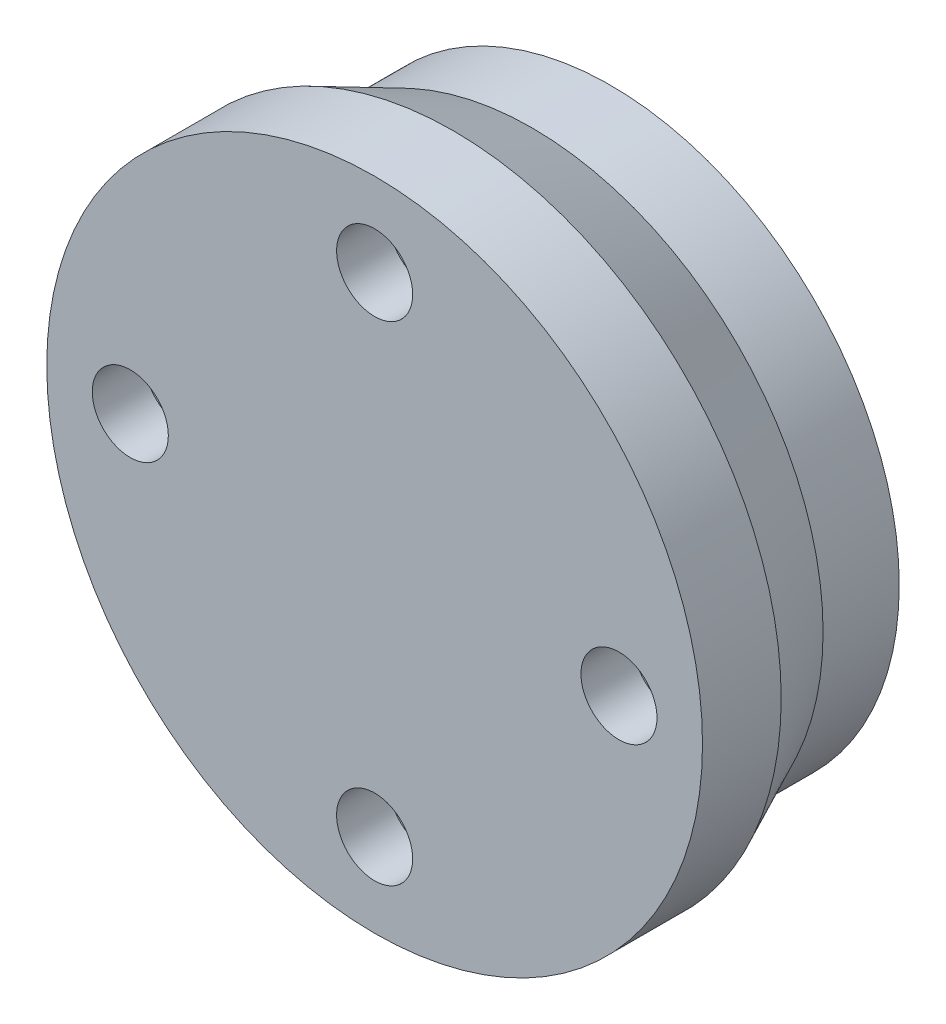
ISO-10303-21;
HEADER;
FILE_DESCRIPTION(('STEP AP214'),'2;1');
FILE_NAME('part.step','',(''),(''),'','','');
FILE_SCHEMA(('AUTOMOTIVE_DESIGN { 1 0 10303 214 1 1 1 1 }'));
ENDSEC;
DATA;
#1=APPLICATION_CONTEXT('core data for automotive mechanical design processes');
#2=APPLICATION_PROTOCOL_DEFINITION('international standard','automotive_design',2000,#1);
#3=PRODUCT_CONTEXT('',#1,'mechanical');
#4=PRODUCT('Part','Part','',(#3));
#5=PRODUCT_RELATED_PRODUCT_CATEGORY('part','',(#4));
#6=PRODUCT_DEFINITION_FORMATION('','',#4);
#7=PRODUCT_DEFINITION_CONTEXT('part definition',#1,'design');
#8=PRODUCT_DEFINITION('design','',#6,#7);
#9=PRODUCT_DEFINITION_SHAPE('','',#8);
#10=(LENGTH_UNIT() NAMED_UNIT(*) SI_UNIT(.MILLI.,.METRE.));
#11=(NAMED_UNIT(*) PLANE_ANGLE_UNIT() SI_UNIT($,.RADIAN.));
#12=(NAMED_UNIT(*) SI_UNIT($,.STERADIAN.) SOLID_ANGLE_UNIT());
#13=UNCERTAINTY_MEASURE_WITH_UNIT(LENGTH_MEASURE(1.E-05),#10,'distance_accuracy_value','');
#14=(GEOMETRIC_REPRESENTATION_CONTEXT(3) GLOBAL_UNCERTAINTY_ASSIGNED_CONTEXT((#13)) GLOBAL_UNIT_ASSIGNED_CONTEXT((#10,
#11,#12)) REPRESENTATION_CONTEXT('',''));
#15=CARTESIAN_POINT('',(0.,0.,0.));
#16=DIRECTION('',(0.,0.,1.));
#17=DIRECTION('',(1.,0.,0.));
#18=AXIS2_PLACEMENT_3D('',#15,#16,#17);
#19=CARTESIAN_POINT('',(0.,0.,1.5));
#20=DIRECTION('',(0.,0.,-1.));
#21=DIRECTION('',(-1.,0.,0.));
#22=AXIS2_PLACEMENT_3D('',#19,#20,#21);
#23=CYLINDRICAL_SURFACE('',#22,11.);
#24=CARTESIAN_POINT('',(0.,0.,1.5));
#25=DIRECTION('',(0.,0.,1.));
#26=DIRECTION('',(1.,0.,0.));
#27=AXIS2_PLACEMENT_3D('',#24,#25,#26);
#28=CIRCLE('',#27,11.);
#29=CARTESIAN_POINT('',(11.,0.,1.5));
#30=VERTEX_POINT('',#29);
#31=EDGE_CURVE('E10',#30,#30,#28,.T.);
#32=ORIENTED_EDGE('',*,*,#31,.F.);
#33=EDGE_LOOP('',(#32));
#34=FACE_BOUND('',#33,.T.);
#35=CARTESIAN_POINT('',(0.,0.,-1.5));
#36=DIRECTION('',(0.,0.,1.));
#37=DIRECTION('',(1.,0.,0.));
#38=AXIS2_PLACEMENT_3D('',#35,#36,#37);
#39=CIRCLE('',#38,11.);
#40=CARTESIAN_POINT('',(11.,0.,-1.5));
#41=VERTEX_POINT('',#40);
#42=EDGE_CURVE('E33',#41,#41,#39,.T.);
#43=ORIENTED_EDGE('',*,*,#42,.T.);
#44=EDGE_LOOP('',(#43));
#45=FACE_BOUND('',#44,.T.);
#46=ADVANCED_FACE('F30',(#34,#45),#23,.T.);
#47=CARTESIAN_POINT('',(0.,0.,-1.5));
#48=DIRECTION('',(0.,0.,1.));
#49=DIRECTION('',(1.,0.,0.));
#50=AXIS2_PLACEMENT_3D('',#47,#48,#49);
#51=PLANE('',#50);
#52=CARTESIAN_POINT('',(0.,7.5,-1.5));
#53=DIRECTION('',(0.,0.,-1.));
#54=DIRECTION('',(-1.,0.,0.));
#55=AXIS2_PLACEMENT_3D('',#52,#53,#54);
#56=CIRCLE('',#55,1.5);
#57=CARTESIAN_POINT('',(-1.50000000000005,7.5,-1.5));
#58=VERTEX_POINT('',#57);
#59=EDGE_CURVE('E93',#58,#58,#56,.T.);
#60=ORIENTED_EDGE('',*,*,#59,.F.);
#61=EDGE_LOOP('',(#60));
#62=FACE_BOUND('',#61,.T.);
#63=CARTESIAN_POINT('',(-7.5,0.,-1.5));
#64=DIRECTION('',(0.,0.,-1.));
#65=DIRECTION('',(-1.,0.,0.));
#66=AXIS2_PLACEMENT_3D('',#63,#64,#65);
#67=CIRCLE('',#66,1.50000000000027);
#68=CARTESIAN_POINT('',(-9.00000000000027,0.,-1.5));
#69=VERTEX_POINT('',#68);
#70=EDGE_CURVE('E87',#69,#69,#67,.T.);
#71=ORIENTED_EDGE('',*,*,#70,.F.);
#72=EDGE_LOOP('',(#71));
#73=FACE_BOUND('',#72,.T.);
#74=CARTESIAN_POINT('',(0.,-7.50000000000003,-1.5));
#75=DIRECTION('',(0.,0.,-1.));
#76=DIRECTION('',(-1.,0.,0.));
#77=AXIS2_PLACEMENT_3D('',#74,#75,#76);
#78=CIRCLE('',#77,1.50000000000043);
#79=CARTESIAN_POINT('',(-1.50000000000036,-7.50000000000003,-1.5));
#80=VERTEX_POINT('',#79);
#81=EDGE_CURVE('E81',#80,#80,#78,.T.);
#82=ORIENTED_EDGE('',*,*,#81,.F.);
#83=EDGE_LOOP('',(#82));
#84=FACE_BOUND('',#83,.T.);
#85=CARTESIAN_POINT('',(7.50000000000002,0.,-1.5));
#86=DIRECTION('',(0.,0.,-1.));
#87=DIRECTION('',(-1.,0.,0.));
#88=AXIS2_PLACEMENT_3D('',#85,#86,#87);
#89=CIRCLE('',#88,1.5000000000001);
#90=CARTESIAN_POINT('',(5.99999999999993,0.,-1.5));
#91=VERTEX_POINT('',#90);
#92=EDGE_CURVE('E75',#91,#91,#89,.T.);
#93=ORIENTED_EDGE('',*,*,#92,.F.);
#94=EDGE_LOOP('',(#93));
#95=FACE_BOUND('',#94,.T.);
#96=ORIENTED_EDGE('',*,*,#42,.F.);
#97=EDGE_LOOP('',(#96));
#98=FACE_BOUND('',#97,.T.);
#99=ADVANCED_FACE('F108',(#62,#73,#84,#95,#98),#51,.F.);
#100=CARTESIAN_POINT('',(0.,0.,1.5));
#101=DIRECTION('',(0.,0.,1.));
#102=DIRECTION('',(1.,0.,0.));
#103=AXIS2_PLACEMENT_3D('',#100,#101,#102);
#104=CONICAL_SURFACE('',#103,11.0964894023198,0.437587658819575);
#105=CARTESIAN_POINT('',(0.,0.,4.5));
#106=DIRECTION('',(0.,0.,1.));
#107=DIRECTION('',(1.,0.,0.));
#108=AXIS2_PLACEMENT_3D('',#105,#106,#107);
#109=CIRCLE('',#108,12.5);
#110=CARTESIAN_POINT('',(12.5,0.,4.5));
#111=VERTEX_POINT('',#110);
#112=EDGE_CURVE('E45',#111,#111,#109,.T.);
#113=ORIENTED_EDGE('',*,*,#112,.F.);
#114=EDGE_LOOP('',(#113));
#115=FACE_BOUND('',#114,.T.);
#116=CARTESIAN_POINT('',(0.,0.,1.5));
#117=DIRECTION('',(0.,0.,-1.));
#118=DIRECTION('',(-1.,0.,0.));
#119=AXIS2_PLACEMENT_3D('',#116,#117,#118);
#120=CIRCLE('',#119,11.0964894023198);
#121=CARTESIAN_POINT('',(-11.0964894023198,0.,1.5));
#122=VERTEX_POINT('',#121);
#123=EDGE_CURVE('E40',#122,#122,#120,.T.);
#124=ORIENTED_EDGE('',*,*,#123,.F.);
#125=EDGE_LOOP('',(#124));
#126=FACE_BOUND('',#125,.T.);
#127=ADVANCED_FACE('F111',(#115,#126),#104,.T.);
#128=CARTESIAN_POINT('',(0.,11.0964894023198,1.5));
#129=DIRECTION('',(0.,0.,-1.));
#130=DIRECTION('',(-1.,0.,0.));
#131=AXIS2_PLACEMENT_3D('',#128,#129,#130);
#132=PLANE('',#131);
#133=ORIENTED_EDGE('',*,*,#31,.T.);
#134=EDGE_LOOP('',(#133));
#135=FACE_BOUND('',#134,.T.);
#136=ORIENTED_EDGE('',*,*,#123,.T.);
#137=EDGE_LOOP('',(#136));
#138=FACE_BOUND('',#137,.T.);
#139=ADVANCED_FACE('F136',(#135,#138),#132,.T.);
#140=CARTESIAN_POINT('',(0.,0.,7.5));
#141=DIRECTION('',(0.,0.,-1.));
#142=DIRECTION('',(-1.,0.,0.));
#143=AXIS2_PLACEMENT_3D('',#140,#141,#142);
#144=CYLINDRICAL_SURFACE('',#143,12.5);
#145=CARTESIAN_POINT('',(0.,0.,7.5));
#146=DIRECTION('',(0.,0.,1.));
#147=DIRECTION('',(1.,0.,0.));
#148=AXIS2_PLACEMENT_3D('',#145,#146,#147);
#149=CIRCLE('',#148,12.5);
#150=CARTESIAN_POINT('',(12.5,0.,7.5));
#151=VERTEX_POINT('',#150);
#152=EDGE_CURVE('E44',#151,#151,#149,.T.);
#153=ORIENTED_EDGE('',*,*,#152,.F.);
#154=EDGE_LOOP('',(#153));
#155=FACE_BOUND('',#154,.T.);
#156=ORIENTED_EDGE('',*,*,#112,.T.);
#157=EDGE_LOOP('',(#156));
#158=FACE_BOUND('',#157,.T.);
#159=ADVANCED_FACE('F144',(#155,#158),#144,.T.);
#160=CARTESIAN_POINT('',(0.,0.,7.5));
#161=DIRECTION('',(0.,0.,1.));
#162=DIRECTION('',(1.,0.,0.));
#163=AXIS2_PLACEMENT_3D('',#160,#161,#162);
#164=PLANE('',#163);
#165=CARTESIAN_POINT('',(0.,9.315,7.5));
#166=DIRECTION('',(0.,0.,1.));
#167=DIRECTION('',(1.,0.,0.));
#168=AXIS2_PLACEMENT_3D('',#165,#166,#167);
#169=CIRCLE('',#168,1.45);
#170=CARTESIAN_POINT('',(1.45000000000009,9.315,7.5));
#171=VERTEX_POINT('',#170);
#172=EDGE_CURVE('E70',#171,#171,#169,.T.);
#173=ORIENTED_EDGE('',*,*,#172,.F.);
#174=EDGE_LOOP('',(#173));
#175=FACE_BOUND('',#174,.T.);
#176=CARTESIAN_POINT('',(9.315,-1.26623147733342E-13,7.5));
#177=DIRECTION('',(0.,0.,1.));
#178=DIRECTION('',(1.,0.,0.));
#179=AXIS2_PLACEMENT_3D('',#176,#177,#178);
#180=CIRCLE('',#179,1.45);
#181=CARTESIAN_POINT('',(10.765,-1.26623147733342E-13,7.5));
#182=VERTEX_POINT('',#181);
#183=EDGE_CURVE('E64',#182,#182,#180,.T.);
#184=ORIENTED_EDGE('',*,*,#183,.F.);
#185=EDGE_LOOP('',(#184));
#186=FACE_BOUND('',#185,.T.);
#187=CARTESIAN_POINT('',(-1.59146296404665E-13,-9.315,7.5));
#188=DIRECTION('',(0.,0.,1.));
#189=DIRECTION('',(1.,0.,0.));
#190=AXIS2_PLACEMENT_3D('',#187,#188,#189);
#191=CIRCLE('',#190,1.45);
#192=CARTESIAN_POINT('',(1.44999999999984,-9.315,7.5));
#193=VERTEX_POINT('',#192);
#194=EDGE_CURVE('E58',#193,#193,#191,.T.);
#195=ORIENTED_EDGE('',*,*,#194,.F.);
#196=EDGE_LOOP('',(#195));
#197=FACE_BOUND('',#196,.T.);
#198=CARTESIAN_POINT('',(-9.315,1.91669445075989E-13,7.5));
#199=DIRECTION('',(0.,0.,1.));
#200=DIRECTION('',(1.,0.,0.));
#201=AXIS2_PLACEMENT_3D('',#198,#199,#200);
#202=CIRCLE('',#201,1.45);
#203=CARTESIAN_POINT('',(-7.865,1.91669445075989E-13,7.5));
#204=VERTEX_POINT('',#203);
#205=EDGE_CURVE('E51',#204,#204,#202,.T.);
#206=ORIENTED_EDGE('',*,*,#205,.F.);
#207=EDGE_LOOP('',(#206));
#208=FACE_BOUND('',#207,.T.);
#209=ORIENTED_EDGE('',*,*,#152,.T.);
#210=EDGE_LOOP('',(#209));
#211=FACE_BOUND('',#210,.T.);
#212=ADVANCED_FACE('F151',(#175,#186,#197,#208,#211),#164,.T.);
#213=CARTESIAN_POINT('',(-9.315,1.91669445075989E-13,5.5));
#214=DIRECTION('',(0.,0.,1.));
#215=DIRECTION('',(1.,0.,0.));
#216=AXIS2_PLACEMENT_3D('',#213,#214,#215);
#217=CYLINDRICAL_SURFACE('',#216,1.45);
#218=CARTESIAN_POINT('',(-9.315,1.91669445075989E-13,5.5));
#219=DIRECTION('',(0.,0.,1.));
#220=DIRECTION('',(1.,0.,0.));
#221=AXIS2_PLACEMENT_3D('',#218,#219,#220);
#222=CIRCLE('',#221,1.45);
#223=CARTESIAN_POINT('',(-7.865,1.91669445075989E-13,5.5));
#224=VERTEX_POINT('',#223);
#225=EDGE_CURVE('E54',#224,#224,#222,.T.);
#226=ORIENTED_EDGE('',*,*,#225,.F.);
#227=EDGE_LOOP('',(#226));
#228=FACE_BOUND('',#227,.T.);
#229=ORIENTED_EDGE('',*,*,#205,.T.);
#230=EDGE_LOOP('',(#229));
#231=FACE_BOUND('',#230,.T.);
#232=ADVANCED_FACE('F159',(#228,#231),#217,.F.);
#233=CARTESIAN_POINT('',(-9.315,1.91669445075989E-13,5.5));
#234=DIRECTION('',(0.,0.,1.));
#235=DIRECTION('',(1.,0.,0.));
#236=AXIS2_PLACEMENT_3D('',#233,#234,#235);
#237=PLANE('',#236);
#238=ORIENTED_EDGE('',*,*,#225,.T.);
#239=EDGE_LOOP('',(#238));
#240=FACE_BOUND('',#239,.T.);
#241=ADVANCED_FACE('F167',(#240),#237,.T.);
#242=CARTESIAN_POINT('',(-1.59146296404665E-13,-9.315,5.5));
#243=DIRECTION('',(0.,0.,1.));
#244=DIRECTION('',(1.,0.,0.));
#245=AXIS2_PLACEMENT_3D('',#242,#243,#244);
#246=CYLINDRICAL_SURFACE('',#245,1.45);
#247=CARTESIAN_POINT('',(-1.59146296404665E-13,-9.315,5.5));
#248=DIRECTION('',(0.,0.,1.));
#249=DIRECTION('',(1.,0.,0.));
#250=AXIS2_PLACEMENT_3D('',#247,#248,#249);
#251=CIRCLE('',#250,1.45);
#252=CARTESIAN_POINT('',(1.44999999999984,-9.315,5.5));
#253=VERTEX_POINT('',#252);
#254=EDGE_CURVE('E61',#253,#253,#251,.T.);
#255=ORIENTED_EDGE('',*,*,#254,.F.);
#256=EDGE_LOOP('',(#255));
#257=FACE_BOUND('',#256,.T.);
#258=ORIENTED_EDGE('',*,*,#194,.T.);
#259=EDGE_LOOP('',(#258));
#260=FACE_BOUND('',#259,.T.);
#261=ADVANCED_FACE('F175',(#257,#260),#246,.F.);
#262=CARTESIAN_POINT('',(-1.59146296404665E-13,-9.315,5.5));
#263=DIRECTION('',(0.,0.,1.));
#264=DIRECTION('',(1.,0.,0.));
#265=AXIS2_PLACEMENT_3D('',#262,#263,#264);
#266=PLANE('',#265);
#267=ORIENTED_EDGE('',*,*,#254,.T.);
#268=EDGE_LOOP('',(#267));
#269=FACE_BOUND('',#268,.T.);
#270=ADVANCED_FACE('F183',(#269),#266,.T.);
#271=CARTESIAN_POINT('',(9.315,-1.26623147733342E-13,5.5));
#272=DIRECTION('',(0.,0.,1.));
#273=DIRECTION('',(1.,0.,0.));
#274=AXIS2_PLACEMENT_3D('',#271,#272,#273);
#275=CYLINDRICAL_SURFACE('',#274,1.45);
#276=CARTESIAN_POINT('',(9.315,-1.26623147733342E-13,5.5));
#277=DIRECTION('',(0.,0.,1.));
#278=DIRECTION('',(1.,0.,0.));
#279=AXIS2_PLACEMENT_3D('',#276,#277,#278);
#280=CIRCLE('',#279,1.45);
#281=CARTESIAN_POINT('',(10.765,-1.26623147733342E-13,5.5));
#282=VERTEX_POINT('',#281);
#283=EDGE_CURVE('E67',#282,#282,#280,.T.);
#284=ORIENTED_EDGE('',*,*,#283,.F.);
#285=EDGE_LOOP('',(#284));
#286=FACE_BOUND('',#285,.T.);
#287=ORIENTED_EDGE('',*,*,#183,.T.);
#288=EDGE_LOOP('',(#287));
#289=FACE_BOUND('',#288,.T.);
#290=ADVANCED_FACE('F191',(#286,#289),#275,.F.);
#291=CARTESIAN_POINT('',(9.315,-1.26623147733342E-13,5.5));
#292=DIRECTION('',(0.,0.,1.));
#293=DIRECTION('',(1.,0.,0.));
#294=AXIS2_PLACEMENT_3D('',#291,#292,#293);
#295=PLANE('',#294);
#296=ORIENTED_EDGE('',*,*,#283,.T.);
#297=EDGE_LOOP('',(#296));
#298=FACE_BOUND('',#297,.T.);
#299=ADVANCED_FACE('F199',(#298),#295,.T.);
#300=CARTESIAN_POINT('',(0.,9.315,5.5));
#301=DIRECTION('',(0.,0.,1.));
#302=DIRECTION('',(1.,0.,0.));
#303=AXIS2_PLACEMENT_3D('',#300,#301,#302);
#304=CYLINDRICAL_SURFACE('',#303,1.45);
#305=CARTESIAN_POINT('',(0.,9.315,5.5));
#306=DIRECTION('',(0.,0.,1.));
#307=DIRECTION('',(1.,0.,0.));
#308=AXIS2_PLACEMENT_3D('',#305,#306,#307);
#309=CIRCLE('',#308,1.45);
#310=CARTESIAN_POINT('',(1.45000000000009,9.315,5.5));
#311=VERTEX_POINT('',#310);
#312=EDGE_CURVE('E48',#311,#311,#309,.T.);
#313=ORIENTED_EDGE('',*,*,#312,.F.);
#314=EDGE_LOOP('',(#313));
#315=FACE_BOUND('',#314,.T.);
#316=ORIENTED_EDGE('',*,*,#172,.T.);
#317=EDGE_LOOP('',(#316));
#318=FACE_BOUND('',#317,.T.);
#319=ADVANCED_FACE('F207',(#315,#318),#304,.F.);
#320=CARTESIAN_POINT('',(0.,9.315,5.5));
#321=DIRECTION('',(0.,0.,1.));
#322=DIRECTION('',(1.,0.,0.));
#323=AXIS2_PLACEMENT_3D('',#320,#321,#322);
#324=PLANE('',#323);
#325=ORIENTED_EDGE('',*,*,#312,.T.);
#326=EDGE_LOOP('',(#325));
#327=FACE_BOUND('',#326,.T.);
#328=ADVANCED_FACE('F215',(#327),#324,.T.);
#329=CARTESIAN_POINT('',(7.50000000000002,0.,0.5));
#330=DIRECTION('',(0.,0.,-1.));
#331=DIRECTION('',(-1.,0.,0.));
#332=AXIS2_PLACEMENT_3D('',#329,#330,#331);
#333=CYLINDRICAL_SURFACE('',#332,1.5000000000001);
#334=CARTESIAN_POINT('',(7.50000000000002,0.,0.5));
#335=DIRECTION('',(0.,0.,-1.));
#336=DIRECTION('',(-1.,0.,0.));
#337=AXIS2_PLACEMENT_3D('',#334,#335,#336);
#338=CIRCLE('',#337,1.5000000000001);
#339=CARTESIAN_POINT('',(5.99999999999993,0.,0.5));
#340=VERTEX_POINT('',#339);
#341=EDGE_CURVE('E78',#340,#340,#338,.T.);
#342=ORIENTED_EDGE('',*,*,#341,.F.);
#343=EDGE_LOOP('',(#342));
#344=FACE_BOUND('',#343,.T.);
#345=ORIENTED_EDGE('',*,*,#92,.T.);
#346=EDGE_LOOP('',(#345));
#347=FACE_BOUND('',#346,.T.);
#348=ADVANCED_FACE('F222',(#344,#347),#333,.F.);
#349=CARTESIAN_POINT('',(7.50000000000002,0.,0.5));
#350=DIRECTION('',(0.,0.,-1.));
#351=DIRECTION('',(-1.,0.,0.));
#352=AXIS2_PLACEMENT_3D('',#349,#350,#351);
#353=PLANE('',#352);
#354=ORIENTED_EDGE('',*,*,#341,.T.);
#355=EDGE_LOOP('',(#354));
#356=FACE_BOUND('',#355,.T.);
#357=ADVANCED_FACE('F229',(#356),#353,.T.);
#358=CARTESIAN_POINT('',(0.,-7.50000000000003,0.5));
#359=DIRECTION('',(0.,0.,-1.));
#360=DIRECTION('',(-1.,0.,0.));
#361=AXIS2_PLACEMENT_3D('',#358,#359,#360);
#362=CYLINDRICAL_SURFACE('',#361,1.50000000000043);
#363=CARTESIAN_POINT('',(0.,-7.50000000000003,0.5));
#364=DIRECTION('',(0.,0.,-1.));
#365=DIRECTION('',(-1.,0.,0.));
#366=AXIS2_PLACEMENT_3D('',#363,#364,#365);
#367=CIRCLE('',#366,1.50000000000043);
#368=CARTESIAN_POINT('',(-1.50000000000036,-7.50000000000003,0.5));
#369=VERTEX_POINT('',#368);
#370=EDGE_CURVE('E84',#369,#369,#367,.T.);
#371=ORIENTED_EDGE('',*,*,#370,.F.);
#372=EDGE_LOOP('',(#371));
#373=FACE_BOUND('',#372,.T.);
#374=ORIENTED_EDGE('',*,*,#81,.T.);
#375=EDGE_LOOP('',(#374));
#376=FACE_BOUND('',#375,.T.);
#377=ADVANCED_FACE('F237',(#373,#376),#362,.F.);
#378=CARTESIAN_POINT('',(0.,-7.50000000000003,0.5));
#379=DIRECTION('',(0.,0.,-1.));
#380=DIRECTION('',(-1.,0.,0.));
#381=AXIS2_PLACEMENT_3D('',#378,#379,#380);
#382=PLANE('',#381);
#383=ORIENTED_EDGE('',*,*,#370,.T.);
#384=EDGE_LOOP('',(#383));
#385=FACE_BOUND('',#384,.T.);
#386=ADVANCED_FACE('F245',(#385),#382,.T.);
#387=CARTESIAN_POINT('',(-7.5,0.,0.5));
#388=DIRECTION('',(0.,0.,-1.));
#389=DIRECTION('',(-1.,0.,0.));
#390=AXIS2_PLACEMENT_3D('',#387,#388,#389);
#391=CYLINDRICAL_SURFACE('',#390,1.50000000000027);
#392=CARTESIAN_POINT('',(-7.5,0.,0.5));
#393=DIRECTION('',(0.,0.,-1.));
#394=DIRECTION('',(-1.,0.,0.));
#395=AXIS2_PLACEMENT_3D('',#392,#393,#394);
#396=CIRCLE('',#395,1.50000000000027);
#397=CARTESIAN_POINT('',(-9.00000000000027,0.,0.5));
#398=VERTEX_POINT('',#397);
#399=EDGE_CURVE('E90',#398,#398,#396,.T.);
#400=ORIENTED_EDGE('',*,*,#399,.F.);
#401=EDGE_LOOP('',(#400));
#402=FACE_BOUND('',#401,.T.);
#403=ORIENTED_EDGE('',*,*,#70,.T.);
#404=EDGE_LOOP('',(#403));
#405=FACE_BOUND('',#404,.T.);
#406=ADVANCED_FACE('F253',(#402,#405),#391,.F.);
#407=CARTESIAN_POINT('',(-7.5,0.,0.5));
#408=DIRECTION('',(0.,0.,-1.));
#409=DIRECTION('',(-1.,0.,0.));
#410=AXIS2_PLACEMENT_3D('',#407,#408,#409);
#411=PLANE('',#410);
#412=ORIENTED_EDGE('',*,*,#399,.T.);
#413=EDGE_LOOP('',(#412));
#414=FACE_BOUND('',#413,.T.);
#415=ADVANCED_FACE('F104',(#414),#411,.T.);
#416=CARTESIAN_POINT('',(0.,7.5,0.5));
#417=DIRECTION('',(0.,0.,-1.));
#418=DIRECTION('',(-1.,0.,0.));
#419=AXIS2_PLACEMENT_3D('',#416,#417,#418);
#420=CYLINDRICAL_SURFACE('',#419,1.5);
#421=CARTESIAN_POINT('',(0.,7.5,0.5));
#422=DIRECTION('',(0.,0.,-1.));
#423=DIRECTION('',(-1.,0.,0.));
#424=AXIS2_PLACEMENT_3D('',#421,#422,#423);
#425=CIRCLE('',#424,1.5);
#426=CARTESIAN_POINT('',(-1.50000000000005,7.5,0.5));
#427=VERTEX_POINT('',#426);
#428=EDGE_CURVE('E55',#427,#427,#425,.T.);
#429=ORIENTED_EDGE('',*,*,#428,.F.);
#430=EDGE_LOOP('',(#429));
#431=FACE_BOUND('',#430,.T.);
#432=ORIENTED_EDGE('',*,*,#59,.T.);
#433=EDGE_LOOP('',(#432));
#434=FACE_BOUND('',#433,.T.);
#435=ADVANCED_FACE('F101',(#431,#434),#420,.F.);
#436=CARTESIAN_POINT('',(0.,7.5,0.5));
#437=DIRECTION('',(0.,0.,-1.));
#438=DIRECTION('',(-1.,0.,0.));
#439=AXIS2_PLACEMENT_3D('',#436,#437,#438);
#440=PLANE('',#439);
#441=ORIENTED_EDGE('',*,*,#428,.T.);
#442=EDGE_LOOP('',(#441));
#443=FACE_BOUND('',#442,.T.);
#444=ADVANCED_FACE('F99',(#443),#440,.T.);
#445=CLOSED_SHELL('',(#46,#99,#127,#139,#159,#212,#232,#241,#261,#270,#290,#299,#319,#328,#348,
#357,#377,#386,#406,#415,#435,#444));
#446=MANIFOLD_SOLID_BREP('B2',#445);
#447=ADVANCED_BREP_SHAPE_REPRESENTATION('',(#18,#446),#14);
#448=SHAPE_DEFINITION_REPRESENTATION(#9,#447);
ENDSEC;
END-ISO-10303-21;
